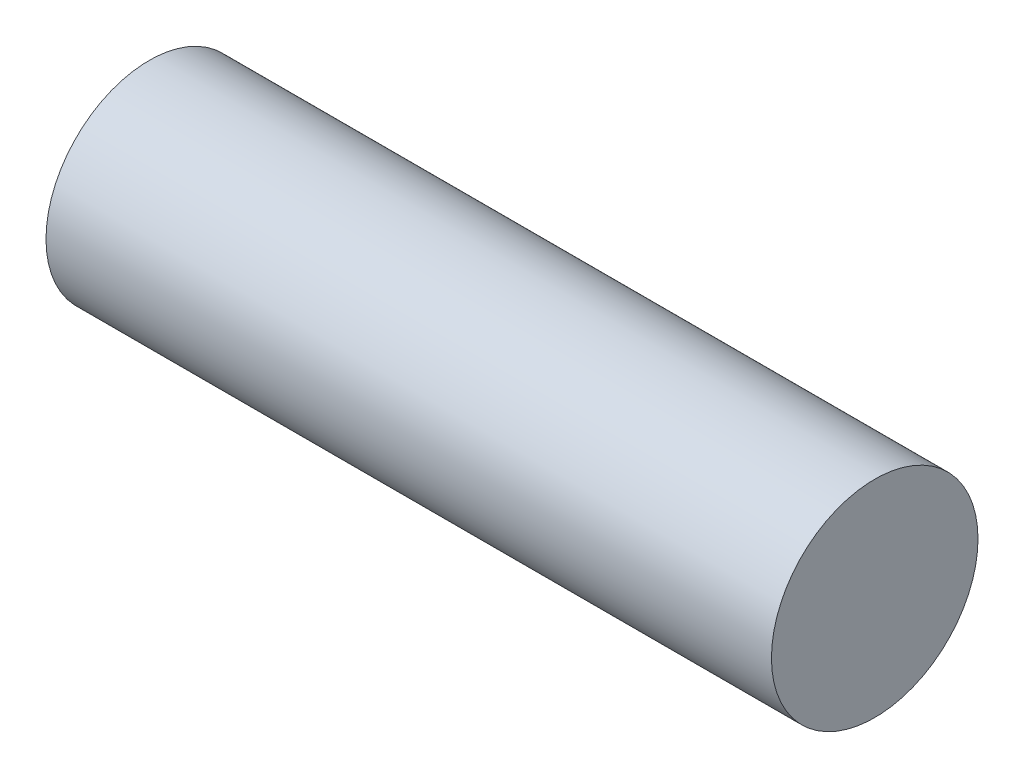
ISO-10303-21;
HEADER;
FILE_DESCRIPTION(('STEP AP214'),'2;1');
FILE_NAME('part.step','',(''),(''),'','','');
FILE_SCHEMA(('AUTOMOTIVE_DESIGN { 1 0 10303 214 1 1 1 1 }'));
ENDSEC;
DATA;
#1=APPLICATION_CONTEXT('core data for automotive mechanical design processes');
#2=APPLICATION_PROTOCOL_DEFINITION('international standard','automotive_design',2000,#1);
#3=PRODUCT_CONTEXT('',#1,'mechanical');
#4=PRODUCT('Part','Part','',(#3));
#5=PRODUCT_RELATED_PRODUCT_CATEGORY('part','',(#4));
#6=PRODUCT_DEFINITION_FORMATION('','',#4);
#7=PRODUCT_DEFINITION_CONTEXT('part definition',#1,'design');
#8=PRODUCT_DEFINITION('design','',#6,#7);
#9=PRODUCT_DEFINITION_SHAPE('','',#8);
#10=(LENGTH_UNIT() NAMED_UNIT(*) SI_UNIT(.MILLI.,.METRE.));
#11=(NAMED_UNIT(*) PLANE_ANGLE_UNIT() SI_UNIT($,.RADIAN.));
#12=(NAMED_UNIT(*) SI_UNIT($,.STERADIAN.) SOLID_ANGLE_UNIT());
#13=UNCERTAINTY_MEASURE_WITH_UNIT(LENGTH_MEASURE(1.E-05),#10,'distance_accuracy_value','');
#14=(GEOMETRIC_REPRESENTATION_CONTEXT(3) GLOBAL_UNCERTAINTY_ASSIGNED_CONTEXT((#13)) GLOBAL_UNIT_ASSIGNED_CONTEXT((#10,
#11,#12)) REPRESENTATION_CONTEXT('',''));
#15=CARTESIAN_POINT('',(0.,0.,0.));
#16=DIRECTION('',(0.,0.,1.));
#17=DIRECTION('',(1.,0.,0.));
#18=AXIS2_PLACEMENT_3D('',#15,#16,#17);
#19=CARTESIAN_POINT('',(72.,0.,0.));
#20=DIRECTION('',(-1.,0.,0.));
#21=DIRECTION('',(0.,0.,1.));
#22=AXIS2_PLACEMENT_3D('',#19,#20,#21);
#23=CYLINDRICAL_SURFACE('',#22,10.25);
#24=CARTESIAN_POINT('',(72.,0.,0.));
#25=DIRECTION('',(1.,0.,0.));
#26=DIRECTION('',(0.,0.,-1.));
#27=AXIS2_PLACEMENT_3D('',#24,#25,#26);
#28=CIRCLE('',#27,10.25);
#29=CARTESIAN_POINT('',(72.,0.,-10.25));
#30=VERTEX_POINT('',#29);
#31=EDGE_CURVE('E10',#30,#30,#28,.T.);
#32=ORIENTED_EDGE('',*,*,#31,.F.);
#33=EDGE_LOOP('',(#32));
#34=FACE_BOUND('',#33,.T.);
#35=CARTESIAN_POINT('',(0.,0.,0.));
#36=DIRECTION('',(1.,0.,0.));
#37=DIRECTION('',(0.,0.,-1.));
#38=AXIS2_PLACEMENT_3D('',#35,#36,#37);
#39=CIRCLE('',#38,10.25);
#40=CARTESIAN_POINT('',(0.,0.,-10.25));
#41=VERTEX_POINT('',#40);
#42=EDGE_CURVE('E34',#41,#41,#39,.T.);
#43=ORIENTED_EDGE('',*,*,#42,.T.);
#44=EDGE_LOOP('',(#43));
#45=FACE_BOUND('',#44,.T.);
#46=ADVANCED_FACE('F31',(#34,#45),#23,.T.);
#47=CARTESIAN_POINT('',(72.,0.,0.));
#48=DIRECTION('',(1.,0.,0.));
#49=DIRECTION('',(0.,0.,-1.));
#50=AXIS2_PLACEMENT_3D('',#47,#48,#49);
#51=PLANE('',#50);
#52=ORIENTED_EDGE('',*,*,#31,.T.);
#53=EDGE_LOOP('',(#52));
#54=FACE_BOUND('',#53,.T.);
#55=ADVANCED_FACE('F46',(#54),#51,.T.);
#56=CARTESIAN_POINT('',(0.,0.,0.));
#57=DIRECTION('',(1.,0.,0.));
#58=DIRECTION('',(0.,0.,-1.));
#59=AXIS2_PLACEMENT_3D('',#56,#57,#58);
#60=PLANE('',#59);
#61=ORIENTED_EDGE('',*,*,#42,.F.);
#62=EDGE_LOOP('',(#61));
#63=FACE_BOUND('',#62,.T.);
#64=ADVANCED_FACE('F44',(#63),#60,.F.);
#65=CLOSED_SHELL('',(#46,#55,#64));
#66=MANIFOLD_SOLID_BREP('B2',#65);
#67=ADVANCED_BREP_SHAPE_REPRESENTATION('',(#18,#66),#14);
#68=SHAPE_DEFINITION_REPRESENTATION(#9,#67);
ENDSEC;
END-ISO-10303-21;
